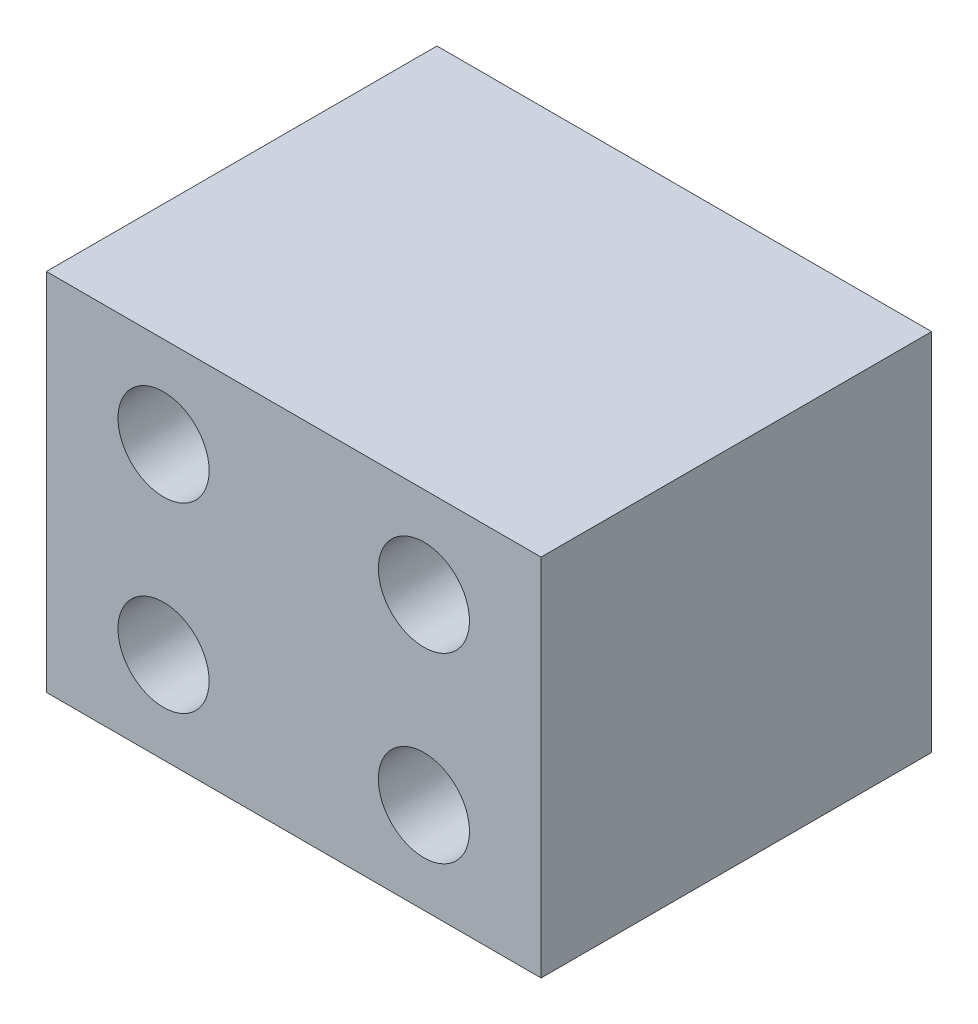
ISO-10303-21;
HEADER;
FILE_DESCRIPTION(('STEP AP214'),'2;1');
FILE_NAME('part.step','',(''),(''),'','','');
FILE_SCHEMA(('AUTOMOTIVE_DESIGN { 1 0 10303 214 1 1 1 1 }'));
ENDSEC;
DATA;
#1=APPLICATION_CONTEXT('core data for automotive mechanical design processes');
#2=APPLICATION_PROTOCOL_DEFINITION('international standard','automotive_design',2000,#1);
#3=PRODUCT_CONTEXT('',#1,'mechanical');
#4=PRODUCT('Part','Part','',(#3));
#5=PRODUCT_RELATED_PRODUCT_CATEGORY('part','',(#4));
#6=PRODUCT_DEFINITION_FORMATION('','',#4);
#7=PRODUCT_DEFINITION_CONTEXT('part definition',#1,'design');
#8=PRODUCT_DEFINITION('design','',#6,#7);
#9=PRODUCT_DEFINITION_SHAPE('','',#8);
#10=(LENGTH_UNIT() NAMED_UNIT(*) SI_UNIT(.MILLI.,.METRE.));
#11=(NAMED_UNIT(*) PLANE_ANGLE_UNIT() SI_UNIT($,.RADIAN.));
#12=(NAMED_UNIT(*) SI_UNIT($,.STERADIAN.) SOLID_ANGLE_UNIT());
#13=UNCERTAINTY_MEASURE_WITH_UNIT(LENGTH_MEASURE(1.E-05),#10,'distance_accuracy_value','');
#14=(GEOMETRIC_REPRESENTATION_CONTEXT(3) GLOBAL_UNCERTAINTY_ASSIGNED_CONTEXT((#13)) GLOBAL_UNIT_ASSIGNED_CONTEXT((#10,
#11,#12)) REPRESENTATION_CONTEXT('',''));
#15=CARTESIAN_POINT('',(0.,0.,0.));
#16=DIRECTION('',(0.,0.,1.));
#17=DIRECTION('',(1.,0.,0.));
#18=AXIS2_PLACEMENT_3D('',#15,#16,#17);
#19=CARTESIAN_POINT('',(0.,0.,15.));
#20=DIRECTION('',(0.,0.,-1.));
#21=DIRECTION('',(-1.,0.,0.));
#22=AXIS2_PLACEMENT_3D('',#19,#20,#21);
#23=PLANE('',#22);
#24=DIRECTION('',(0.,1.,0.));
#25=VECTOR('',#24,1.);
#26=CARTESIAN_POINT('',(9.5,-7.,15.));
#27=LINE('',#26,#25);
#28=CARTESIAN_POINT('',(9.5,-7.,15.));
#29=VERTEX_POINT('',#28);
#30=CARTESIAN_POINT('',(9.5,7.,15.));
#31=VERTEX_POINT('',#30);
#32=EDGE_CURVE('E98',#29,#31,#27,.T.);
#33=ORIENTED_EDGE('',*,*,#32,.T.);
#34=DIRECTION('',(-1.,0.,0.));
#35=VECTOR('',#34,1.);
#36=CARTESIAN_POINT('',(-9.5,7.,15.));
#37=LINE('',#36,#35);
#38=CARTESIAN_POINT('',(-9.5,7.,15.));
#39=VERTEX_POINT('',#38);
#40=EDGE_CURVE('E93',#31,#39,#37,.T.);
#41=ORIENTED_EDGE('',*,*,#40,.T.);
#42=DIRECTION('',(0.,-1.,0.));
#43=VECTOR('',#42,1.);
#44=CARTESIAN_POINT('',(-9.5,-7.,15.));
#45=LINE('',#44,#43);
#46=CARTESIAN_POINT('',(-9.5,-7.,15.));
#47=VERTEX_POINT('',#46);
#48=EDGE_CURVE('E96',#39,#47,#45,.T.);
#49=ORIENTED_EDGE('',*,*,#48,.T.);
#50=DIRECTION('',(1.,0.,0.));
#51=VECTOR('',#50,1.);
#52=CARTESIAN_POINT('',(-9.5,-7.,15.));
#53=LINE('',#52,#51);
#54=EDGE_CURVE('E63',#47,#29,#53,.T.);
#55=ORIENTED_EDGE('',*,*,#54,.T.);
#56=EDGE_LOOP('',(#33,#41,#49,#55));
#57=FACE_BOUND('',#56,.T.);
#58=CARTESIAN_POINT('',(-5.,3.5,15.));
#59=DIRECTION('',(0.,0.,1.));
#60=DIRECTION('',(1.,0.,0.));
#61=AXIS2_PLACEMENT_3D('',#58,#59,#60);
#62=CIRCLE('',#61,1.75);
#63=CARTESIAN_POINT('',(-3.25,3.5,15.));
#64=VERTEX_POINT('',#63);
#65=EDGE_CURVE('E118',#64,#64,#62,.T.);
#66=ORIENTED_EDGE('',*,*,#65,.F.);
#67=EDGE_LOOP('',(#66));
#68=FACE_BOUND('',#67,.T.);
#69=CARTESIAN_POINT('',(5.,3.5,15.));
#70=DIRECTION('',(0.,0.,1.));
#71=DIRECTION('',(1.,0.,0.));
#72=AXIS2_PLACEMENT_3D('',#69,#70,#71);
#73=CIRCLE('',#72,1.75);
#74=CARTESIAN_POINT('',(6.75,3.5,15.));
#75=VERTEX_POINT('',#74);
#76=EDGE_CURVE('E140',#75,#75,#73,.T.);
#77=ORIENTED_EDGE('',*,*,#76,.F.);
#78=EDGE_LOOP('',(#77));
#79=FACE_BOUND('',#78,.T.);
#80=CARTESIAN_POINT('',(5.,-3.5,15.));
#81=DIRECTION('',(0.,0.,1.));
#82=DIRECTION('',(1.,0.,0.));
#83=AXIS2_PLACEMENT_3D('',#80,#81,#82);
#84=CIRCLE('',#83,1.75);
#85=CARTESIAN_POINT('',(6.75,-3.5,15.));
#86=VERTEX_POINT('',#85);
#87=EDGE_CURVE('E148',#86,#86,#84,.T.);
#88=ORIENTED_EDGE('',*,*,#87,.F.);
#89=EDGE_LOOP('',(#88));
#90=FACE_BOUND('',#89,.T.);
#91=CARTESIAN_POINT('',(-5.,-3.5,15.));
#92=DIRECTION('',(0.,0.,1.));
#93=DIRECTION('',(1.,0.,0.));
#94=AXIS2_PLACEMENT_3D('',#91,#92,#93);
#95=CIRCLE('',#94,1.75);
#96=CARTESIAN_POINT('',(-3.25,-3.5,15.));
#97=VERTEX_POINT('',#96);
#98=EDGE_CURVE('E156',#97,#97,#95,.T.);
#99=ORIENTED_EDGE('',*,*,#98,.F.);
#100=EDGE_LOOP('',(#99));
#101=FACE_BOUND('',#100,.T.);
#102=ADVANCED_FACE('F45',(#57,#68,#79,#90,#101),#23,.F.);
#103=CARTESIAN_POINT('',(0.,0.,0.));
#104=DIRECTION('',(0.,0.,-1.));
#105=DIRECTION('',(-1.,0.,0.));
#106=AXIS2_PLACEMENT_3D('',#103,#104,#105);
#107=PLANE('',#106);
#108=CARTESIAN_POINT('',(5.,-3.5,0.));
#109=DIRECTION('',(0.,0.,1.));
#110=DIRECTION('',(1.,0.,0.));
#111=AXIS2_PLACEMENT_3D('',#108,#109,#110);
#112=CIRCLE('',#111,1.75);
#113=CARTESIAN_POINT('',(6.75,-3.5,0.));
#114=VERTEX_POINT('',#113);
#115=EDGE_CURVE('E152',#114,#114,#112,.T.);
#116=ORIENTED_EDGE('',*,*,#115,.T.);
#117=EDGE_LOOP('',(#116));
#118=FACE_BOUND('',#117,.T.);
#119=CARTESIAN_POINT('',(-5.,3.5,0.));
#120=DIRECTION('',(0.,0.,1.));
#121=DIRECTION('',(1.,0.,0.));
#122=AXIS2_PLACEMENT_3D('',#119,#120,#121);
#123=CIRCLE('',#122,1.75);
#124=CARTESIAN_POINT('',(-3.25,3.5,0.));
#125=VERTEX_POINT('',#124);
#126=EDGE_CURVE('E136',#125,#125,#123,.T.);
#127=ORIENTED_EDGE('',*,*,#126,.T.);
#128=EDGE_LOOP('',(#127));
#129=FACE_BOUND('',#128,.T.);
#130=DIRECTION('',(0.,1.,0.));
#131=VECTOR('',#130,1.);
#132=CARTESIAN_POINT('',(9.5,-7.,0.));
#133=LINE('',#132,#131);
#134=CARTESIAN_POINT('',(9.5,-7.,0.));
#135=VERTEX_POINT('',#134);
#136=CARTESIAN_POINT('',(9.5,7.,0.));
#137=VERTEX_POINT('',#136);
#138=EDGE_CURVE('E114',#135,#137,#133,.T.);
#139=ORIENTED_EDGE('',*,*,#138,.F.);
#140=DIRECTION('',(1.,0.,0.));
#141=VECTOR('',#140,1.);
#142=CARTESIAN_POINT('',(-9.5,-7.,0.));
#143=LINE('',#142,#141);
#144=CARTESIAN_POINT('',(-9.5,-7.,0.));
#145=VERTEX_POINT('',#144);
#146=EDGE_CURVE('E86',#145,#135,#143,.T.);
#147=ORIENTED_EDGE('',*,*,#146,.F.);
#148=DIRECTION('',(0.,-1.,0.));
#149=VECTOR('',#148,1.);
#150=CARTESIAN_POINT('',(-9.5,-7.,0.));
#151=LINE('',#150,#149);
#152=CARTESIAN_POINT('',(-9.5,7.,0.));
#153=VERTEX_POINT('',#152);
#154=EDGE_CURVE('E80',#153,#145,#151,.T.);
#155=ORIENTED_EDGE('',*,*,#154,.F.);
#156=DIRECTION('',(-1.,0.,0.));
#157=VECTOR('',#156,1.);
#158=CARTESIAN_POINT('',(-9.5,7.,0.));
#159=LINE('',#158,#157);
#160=EDGE_CURVE('E103',#137,#153,#159,.T.);
#161=ORIENTED_EDGE('',*,*,#160,.F.);
#162=EDGE_LOOP('',(#139,#147,#155,#161));
#163=FACE_BOUND('',#162,.T.);
#164=CARTESIAN_POINT('',(5.,3.5,0.));
#165=DIRECTION('',(0.,0.,1.));
#166=DIRECTION('',(1.,0.,0.));
#167=AXIS2_PLACEMENT_3D('',#164,#165,#166);
#168=CIRCLE('',#167,1.75);
#169=CARTESIAN_POINT('',(6.75,3.5,0.));
#170=VERTEX_POINT('',#169);
#171=EDGE_CURVE('E144',#170,#170,#168,.T.);
#172=ORIENTED_EDGE('',*,*,#171,.T.);
#173=EDGE_LOOP('',(#172));
#174=FACE_BOUND('',#173,.T.);
#175=CARTESIAN_POINT('',(-5.,-3.5,0.));
#176=DIRECTION('',(0.,0.,1.));
#177=DIRECTION('',(1.,0.,0.));
#178=AXIS2_PLACEMENT_3D('',#175,#176,#177);
#179=CIRCLE('',#178,1.75);
#180=CARTESIAN_POINT('',(-3.25,-3.5,0.));
#181=VERTEX_POINT('',#180);
#182=EDGE_CURVE('E160',#181,#181,#179,.T.);
#183=ORIENTED_EDGE('',*,*,#182,.T.);
#184=EDGE_LOOP('',(#183));
#185=FACE_BOUND('',#184,.T.);
#186=ADVANCED_FACE('F131',(#118,#129,#163,#174,#185),#107,.T.);
#187=CARTESIAN_POINT('',(9.5,-7.,15.));
#188=DIRECTION('',(-1.,0.,0.));
#189=DIRECTION('',(0.,0.,1.));
#190=AXIS2_PLACEMENT_3D('',#187,#188,#189);
#191=PLANE('',#190);
#192=ORIENTED_EDGE('',*,*,#138,.T.);
#193=DIRECTION('',(0.,0.,-1.));
#194=VECTOR('',#193,1.);
#195=CARTESIAN_POINT('',(9.5,7.,15.));
#196=LINE('',#195,#194);
#197=EDGE_CURVE('E11',#31,#137,#196,.T.);
#198=ORIENTED_EDGE('',*,*,#197,.F.);
#199=ORIENTED_EDGE('',*,*,#32,.F.);
#200=DIRECTION('',(0.,0.,-1.));
#201=VECTOR('',#200,1.);
#202=CARTESIAN_POINT('',(9.5,-7.,15.));
#203=LINE('',#202,#201);
#204=EDGE_CURVE('E110',#29,#135,#203,.T.);
#205=ORIENTED_EDGE('',*,*,#204,.T.);
#206=EDGE_LOOP('',(#192,#198,#199,#205));
#207=FACE_BOUND('',#206,.T.);
#208=ADVANCED_FACE('F47',(#207),#191,.F.);
#209=CARTESIAN_POINT('',(-9.5,7.,15.));
#210=DIRECTION('',(0.,-1.,0.));
#211=DIRECTION('',(0.,0.,-1.));
#212=AXIS2_PLACEMENT_3D('',#209,#210,#211);
#213=PLANE('',#212);
#214=ORIENTED_EDGE('',*,*,#160,.T.);
#215=DIRECTION('',(0.,0.,-1.));
#216=VECTOR('',#215,1.);
#217=CARTESIAN_POINT('',(-9.5,7.,15.));
#218=LINE('',#217,#216);
#219=EDGE_CURVE('E55',#39,#153,#218,.T.);
#220=ORIENTED_EDGE('',*,*,#219,.F.);
#221=ORIENTED_EDGE('',*,*,#40,.F.);
#222=ORIENTED_EDGE('',*,*,#197,.T.);
#223=EDGE_LOOP('',(#214,#220,#221,#222));
#224=FACE_BOUND('',#223,.T.);
#225=ADVANCED_FACE('F102',(#224),#213,.F.);
#226=CARTESIAN_POINT('',(-9.5,-7.,15.));
#227=DIRECTION('',(1.,0.,0.));
#228=DIRECTION('',(0.,0.,-1.));
#229=AXIS2_PLACEMENT_3D('',#226,#227,#228);
#230=PLANE('',#229);
#231=ORIENTED_EDGE('',*,*,#154,.T.);
#232=DIRECTION('',(0.,0.,-1.));
#233=VECTOR('',#232,1.);
#234=CARTESIAN_POINT('',(-9.5,-7.,15.));
#235=LINE('',#234,#233);
#236=EDGE_CURVE('E105',#47,#145,#235,.T.);
#237=ORIENTED_EDGE('',*,*,#236,.F.);
#238=ORIENTED_EDGE('',*,*,#48,.F.);
#239=ORIENTED_EDGE('',*,*,#219,.T.);
#240=EDGE_LOOP('',(#231,#237,#238,#239));
#241=FACE_BOUND('',#240,.T.);
#242=ADVANCED_FACE('F106',(#241),#230,.F.);
#243=CARTESIAN_POINT('',(-9.5,-7.,15.));
#244=DIRECTION('',(0.,1.,0.));
#245=DIRECTION('',(0.,0.,1.));
#246=AXIS2_PLACEMENT_3D('',#243,#244,#245);
#247=PLANE('',#246);
#248=ORIENTED_EDGE('',*,*,#146,.T.);
#249=ORIENTED_EDGE('',*,*,#204,.F.);
#250=ORIENTED_EDGE('',*,*,#54,.F.);
#251=ORIENTED_EDGE('',*,*,#236,.T.);
#252=EDGE_LOOP('',(#248,#249,#250,#251));
#253=FACE_BOUND('',#252,.T.);
#254=ADVANCED_FACE('F128',(#253),#247,.F.);
#255=CARTESIAN_POINT('',(-5.,3.5,15.));
#256=DIRECTION('',(0.,0.,-1.));
#257=DIRECTION('',(-1.,0.,0.));
#258=AXIS2_PLACEMENT_3D('',#255,#256,#257);
#259=CYLINDRICAL_SURFACE('',#258,1.75);
#260=ORIENTED_EDGE('',*,*,#65,.T.);
#261=EDGE_LOOP('',(#260));
#262=FACE_BOUND('',#261,.T.);
#263=ORIENTED_EDGE('',*,*,#126,.F.);
#264=EDGE_LOOP('',(#263));
#265=FACE_BOUND('',#264,.T.);
#266=ADVANCED_FACE('F179',(#262,#265),#259,.F.);
#267=CARTESIAN_POINT('',(5.,3.5,15.));
#268=DIRECTION('',(0.,0.,-1.));
#269=DIRECTION('',(-1.,0.,0.));
#270=AXIS2_PLACEMENT_3D('',#267,#268,#269);
#271=CYLINDRICAL_SURFACE('',#270,1.75);
#272=ORIENTED_EDGE('',*,*,#76,.T.);
#273=EDGE_LOOP('',(#272));
#274=FACE_BOUND('',#273,.T.);
#275=ORIENTED_EDGE('',*,*,#171,.F.);
#276=EDGE_LOOP('',(#275));
#277=FACE_BOUND('',#276,.T.);
#278=ADVANCED_FACE('F224',(#274,#277),#271,.F.);
#279=CARTESIAN_POINT('',(5.,-3.5,15.));
#280=DIRECTION('',(0.,0.,-1.));
#281=DIRECTION('',(-1.,0.,0.));
#282=AXIS2_PLACEMENT_3D('',#279,#280,#281);
#283=CYLINDRICAL_SURFACE('',#282,1.75);
#284=ORIENTED_EDGE('',*,*,#87,.T.);
#285=EDGE_LOOP('',(#284));
#286=FACE_BOUND('',#285,.T.);
#287=ORIENTED_EDGE('',*,*,#115,.F.);
#288=EDGE_LOOP('',(#287));
#289=FACE_BOUND('',#288,.T.);
#290=ADVANCED_FACE('F232',(#286,#289),#283,.F.);
#291=CARTESIAN_POINT('',(-5.,-3.5,15.));
#292=DIRECTION('',(0.,0.,-1.));
#293=DIRECTION('',(-1.,0.,0.));
#294=AXIS2_PLACEMENT_3D('',#291,#292,#293);
#295=CYLINDRICAL_SURFACE('',#294,1.75);
#296=ORIENTED_EDGE('',*,*,#98,.T.);
#297=EDGE_LOOP('',(#296));
#298=FACE_BOUND('',#297,.T.);
#299=ORIENTED_EDGE('',*,*,#182,.F.);
#300=EDGE_LOOP('',(#299));
#301=FACE_BOUND('',#300,.T.);
#302=ADVANCED_FACE('F168',(#298,#301),#295,.F.);
#303=CLOSED_SHELL('',(#102,#186,#208,#225,#242,#254,#266,#278,#290,#302));
#304=MANIFOLD_SOLID_BREP('B2',#303);
#305=ADVANCED_BREP_SHAPE_REPRESENTATION('',(#18,#304),#14);
#306=SHAPE_DEFINITION_REPRESENTATION(#9,#305);
ENDSEC;
END-ISO-10303-21;
